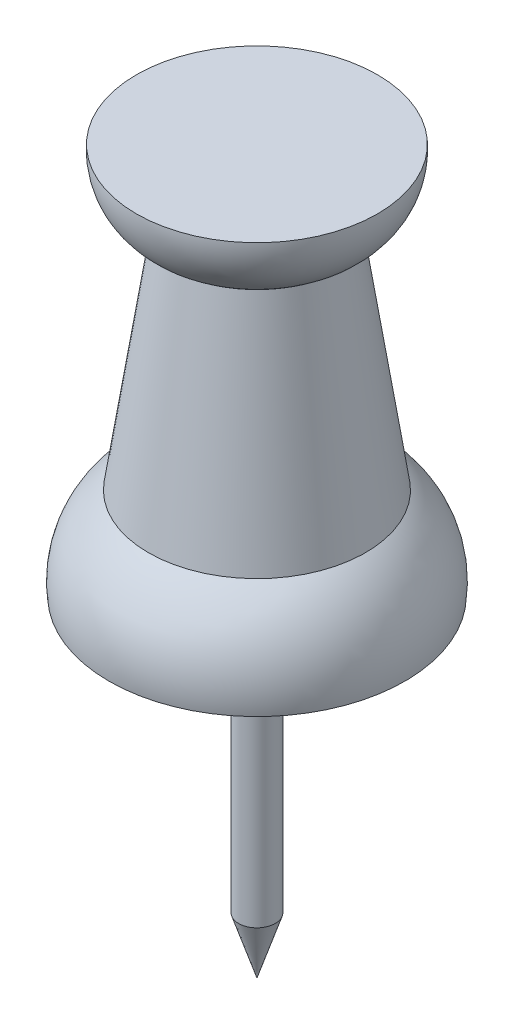
ISO-10303-21;
HEADER;
FILE_DESCRIPTION(('STEP AP214'),'2;1');
FILE_NAME('part.step','',(''),(''),'','','');
FILE_SCHEMA(('AUTOMOTIVE_DESIGN { 1 0 10303 214 1 1 1 1 }'));
ENDSEC;
DATA;
#1=APPLICATION_CONTEXT('core data for automotive mechanical design processes');
#2=APPLICATION_PROTOCOL_DEFINITION('international standard','automotive_design',2000,#1);
#3=PRODUCT_CONTEXT('',#1,'mechanical');
#4=PRODUCT('Part','Part','',(#3));
#5=PRODUCT_RELATED_PRODUCT_CATEGORY('part','',(#4));
#6=PRODUCT_DEFINITION_FORMATION('','',#4);
#7=PRODUCT_DEFINITION_CONTEXT('part definition',#1,'design');
#8=PRODUCT_DEFINITION('design','',#6,#7);
#9=PRODUCT_DEFINITION_SHAPE('','',#8);
#10=(LENGTH_UNIT() NAMED_UNIT(*) SI_UNIT(.MILLI.,.METRE.));
#11=(NAMED_UNIT(*) PLANE_ANGLE_UNIT() SI_UNIT($,.RADIAN.));
#12=(NAMED_UNIT(*) SI_UNIT($,.STERADIAN.) SOLID_ANGLE_UNIT());
#13=UNCERTAINTY_MEASURE_WITH_UNIT(LENGTH_MEASURE(1.E-05),#10,'distance_accuracy_value','');
#14=(GEOMETRIC_REPRESENTATION_CONTEXT(3) GLOBAL_UNCERTAINTY_ASSIGNED_CONTEXT((#13)) GLOBAL_UNIT_ASSIGNED_CONTEXT((#10,
#11,#12)) REPRESENTATION_CONTEXT('',''));
#15=CARTESIAN_POINT('',(0.,0.,0.));
#16=DIRECTION('',(0.,0.,1.));
#17=DIRECTION('',(1.,0.,0.));
#18=AXIS2_PLACEMENT_3D('',#15,#16,#17);
#19=CARTESIAN_POINT('',(0.,7.09537037037038,0.));
#20=DIRECTION('',(0.,-1.,0.));
#21=DIRECTION('',(0.,0.,-1.));
#22=AXIS2_PLACEMENT_3D('',#19,#20,#21);
#23=PLANE('',#22);
#24=CARTESIAN_POINT('',(0.,7.09537037037038,0.));
#25=DIRECTION('',(0.,1.,0.));
#26=DIRECTION('',(0.,0.,1.));
#27=AXIS2_PLACEMENT_3D('',#24,#25,#26);
#28=CIRCLE('',#27,3.95);
#29=CARTESIAN_POINT('',(0.,7.09537037037038,3.95));
#30=VERTEX_POINT('',#29);
#31=EDGE_CURVE('E11',#30,#30,#28,.T.);
#32=ORIENTED_EDGE('',*,*,#31,.T.);
#33=EDGE_LOOP('',(#32));
#34=FACE_BOUND('',#33,.T.);
#35=ADVANCED_FACE('F39',(#34),#23,.F.);
#36=CARTESIAN_POINT('',(0.,6.95757394634211,0.));
#37=DIRECTION('',(0.,1.,0.));
#38=DIRECTION('',(0.,0.,1.));
#39=AXIS2_PLACEMENT_3D('',#36,#37,#38);
#40=DEGENERATE_TOROIDAL_SURFACE('',#39,1.65413150517609,2.3,.T.);
#41=ORIENTED_EDGE('',*,*,#31,.F.);
#42=EDGE_LOOP('',(#41));
#43=FACE_BOUND('',#42,.T.);
#44=CARTESIAN_POINT('',(0.,4.79537037037038,0.));
#45=DIRECTION('',(0.,1.,0.));
#46=DIRECTION('',(0.,0.,1.));
#47=AXIS2_PLACEMENT_3D('',#44,#45,#46);
#48=CIRCLE('',#47,2.43827160493828);
#49=CARTESIAN_POINT('',(0.,4.79537037037038,2.43827160493828));
#50=VERTEX_POINT('',#49);
#51=EDGE_CURVE('E45',#50,#50,#48,.T.);
#52=ORIENTED_EDGE('',*,*,#51,.T.);
#53=EDGE_LOOP('',(#52));
#54=FACE_BOUND('',#53,.T.);
#55=ADVANCED_FACE('F61',(#43,#54),#40,.T.);
#56=CARTESIAN_POINT('',(0.,-2.7145061728395,0.));
#57=DIRECTION('',(0.,-1.,0.));
#58=DIRECTION('',(0.,0.,-1.));
#59=AXIS2_PLACEMENT_3D('',#56,#57,#58);
#60=CONICAL_SURFACE('',#59,3.55772326277441,0.147974343281789);
#61=ORIENTED_EDGE('',*,*,#51,.F.);
#62=EDGE_LOOP('',(#61));
#63=FACE_BOUND('',#62,.T.);
#64=CARTESIAN_POINT('',(0.,-2.7145061728395,0.));
#65=DIRECTION('',(0.,1.,0.));
#66=DIRECTION('',(0.,0.,1.));
#67=AXIS2_PLACEMENT_3D('',#64,#65,#66);
#68=CIRCLE('',#67,3.55772326277441);
#69=CARTESIAN_POINT('',(0.,-2.7145061728395,3.55772326277441));
#70=VERTEX_POINT('',#69);
#71=EDGE_CURVE('E73',#70,#70,#68,.T.);
#72=ORIENTED_EDGE('',*,*,#71,.T.);
#73=EDGE_LOOP('',(#72));
#74=FACE_BOUND('',#73,.T.);
#75=ADVANCED_FACE('F66',(#63,#74),#60,.T.);
#76=CARTESIAN_POINT('',(0.,-5.30316934377201,0.));
#77=DIRECTION('',(0.,1.,0.));
#78=DIRECTION('',(0.,0.,1.));
#79=AXIS2_PLACEMENT_3D('',#76,#77,#78);
#80=DEGENERATE_TOROIDAL_SURFACE('',#79,1.67654730410981,3.2,.T.);
#81=ORIENTED_EDGE('',*,*,#71,.F.);
#82=EDGE_LOOP('',(#81));
#83=FACE_BOUND('',#82,.T.);
#84=CARTESIAN_POINT('',(0.,-5.7145061728395,0.));
#85=DIRECTION('',(0.,1.,0.));
#86=DIRECTION('',(0.,0.,1.));
#87=AXIS2_PLACEMENT_3D('',#84,#85,#86);
#88=CIRCLE('',#87,4.85);
#89=CARTESIAN_POINT('',(0.,-5.7145061728395,4.85));
#90=VERTEX_POINT('',#89);
#91=EDGE_CURVE('E75',#90,#90,#88,.T.);
#92=ORIENTED_EDGE('',*,*,#91,.T.);
#93=EDGE_LOOP('',(#92));
#94=FACE_BOUND('',#93,.T.);
#95=ADVANCED_FACE('F89',(#83,#94),#80,.T.);
#96=CARTESIAN_POINT('',(4.85,-5.7145061728395,0.));
#97=DIRECTION('',(0.,1.,0.));
#98=DIRECTION('',(0.,0.,1.));
#99=AXIS2_PLACEMENT_3D('',#96,#97,#98);
#100=PLANE('',#99);
#101=ORIENTED_EDGE('',*,*,#91,.F.);
#102=EDGE_LOOP('',(#101));
#103=FACE_BOUND('',#102,.T.);
#104=CARTESIAN_POINT('',(0.,-5.7145061728395,0.));
#105=DIRECTION('',(0.,1.,0.));
#106=DIRECTION('',(0.,0.,1.));
#107=AXIS2_PLACEMENT_3D('',#104,#105,#106);
#108=CIRCLE('',#107,0.600000000000001);
#109=CARTESIAN_POINT('',(0.,-5.7145061728395,0.600000000000001));
#110=VERTEX_POINT('',#109);
#111=EDGE_CURVE('E80',#110,#110,#108,.T.);
#112=ORIENTED_EDGE('',*,*,#111,.T.);
#113=EDGE_LOOP('',(#112));
#114=FACE_BOUND('',#113,.T.);
#115=ADVANCED_FACE('F56',(#103,#114),#100,.F.);
#116=CARTESIAN_POINT('',(0.,7.09537037037038,0.));
#117=DIRECTION('',(0.,1.,0.));
#118=DIRECTION('',(0.,0.,1.));
#119=AXIS2_PLACEMENT_3D('',#116,#117,#118);
#120=CYLINDRICAL_SURFACE('',#119,0.600000000000002);
#121=ORIENTED_EDGE('',*,*,#111,.F.);
#122=EDGE_LOOP('',(#121));
#123=FACE_BOUND('',#122,.T.);
#124=CARTESIAN_POINT('',(0.,-14.7145061728395,0.));
#125=DIRECTION('',(0.,1.,0.));
#126=DIRECTION('',(0.,0.,1.));
#127=AXIS2_PLACEMENT_3D('',#124,#125,#126);
#128=CIRCLE('',#127,0.600000000000003);
#129=CARTESIAN_POINT('',(0.,-14.7145061728395,0.600000000000003));
#130=VERTEX_POINT('',#129);
#131=EDGE_CURVE('E83',#130,#130,#128,.T.);
#132=ORIENTED_EDGE('',*,*,#131,.T.);
#133=EDGE_LOOP('',(#132));
#134=FACE_BOUND('',#133,.T.);
#135=ADVANCED_FACE('F50',(#123,#134),#120,.T.);
#136=CARTESIAN_POINT('',(0.,-16.5611162951447,0.));
#137=DIRECTION('',(0.,1.,0.));
#138=DIRECTION('',(0.,0.,1.));
#139=AXIS2_PLACEMENT_3D('',#136,#137,#138);
#140=CONICAL_SURFACE('',#139,0.,0.314159265358981);
#141=ORIENTED_EDGE('',*,*,#131,.F.);
#142=EDGE_LOOP('',(#141));
#143=FACE_BOUND('',#142,.T.);
#144=CARTESIAN_POINT('',(0.,-16.5611162951447,0.));
#145=VERTEX_POINT('',#144);
#146=VERTEX_LOOP('',#145);
#147=FACE_BOUND('',#146,.T.);
#148=ADVANCED_FACE('F48',(#143,#147),#140,.T.);
#149=CLOSED_SHELL('',(#35,#55,#75,#95,#115,#135,#148));
#150=MANIFOLD_SOLID_BREP('B2',#149);
#151=ADVANCED_BREP_SHAPE_REPRESENTATION('',(#18,#150),#14);
#152=SHAPE_DEFINITION_REPRESENTATION(#9,#151);
ENDSEC;
END-ISO-10303-21;
